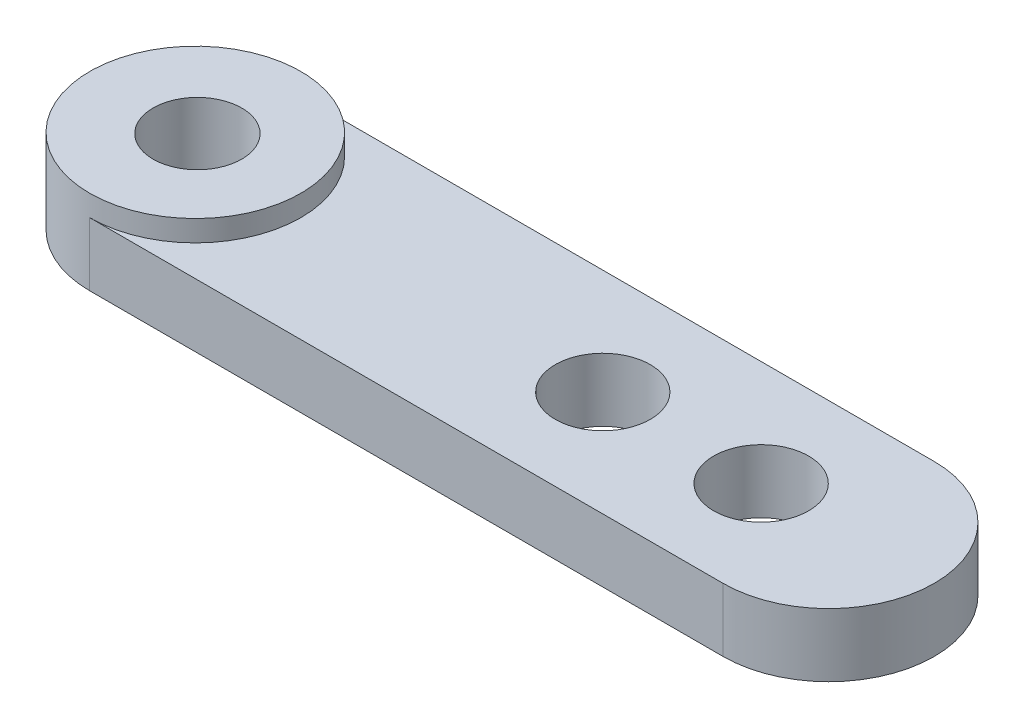
ISO-10303-21;
HEADER;
FILE_DESCRIPTION(('STEP AP214'),'2;1');
FILE_NAME('part.step','',(''),(''),'','','');
FILE_SCHEMA(('AUTOMOTIVE_DESIGN { 1 0 10303 214 1 1 1 1 }'));
ENDSEC;
DATA;
#1=APPLICATION_CONTEXT('core data for automotive mechanical design processes');
#2=APPLICATION_PROTOCOL_DEFINITION('international standard','automotive_design',2000,#1);
#3=PRODUCT_CONTEXT('',#1,'mechanical');
#4=PRODUCT('Part','Part','',(#3));
#5=PRODUCT_RELATED_PRODUCT_CATEGORY('part','',(#4));
#6=PRODUCT_DEFINITION_FORMATION('','',#4);
#7=PRODUCT_DEFINITION_CONTEXT('part definition',#1,'design');
#8=PRODUCT_DEFINITION('design','',#6,#7);
#9=PRODUCT_DEFINITION_SHAPE('','',#8);
#10=(LENGTH_UNIT() NAMED_UNIT(*) SI_UNIT(.MILLI.,.METRE.));
#11=(NAMED_UNIT(*) PLANE_ANGLE_UNIT() SI_UNIT($,.RADIAN.));
#12=(NAMED_UNIT(*) SI_UNIT($,.STERADIAN.) SOLID_ANGLE_UNIT());
#13=UNCERTAINTY_MEASURE_WITH_UNIT(LENGTH_MEASURE(1.E-05),#10,'distance_accuracy_value','');
#14=(GEOMETRIC_REPRESENTATION_CONTEXT(3) GLOBAL_UNCERTAINTY_ASSIGNED_CONTEXT((#13)) GLOBAL_UNIT_ASSIGNED_CONTEXT((#10,
#11,#12)) REPRESENTATION_CONTEXT('',''));
#15=CARTESIAN_POINT('',(0.,0.,0.));
#16=DIRECTION('',(0.,0.,1.));
#17=DIRECTION('',(1.,0.,0.));
#18=AXIS2_PLACEMENT_3D('',#15,#16,#17);
#19=CARTESIAN_POINT('',(0.,3.,0.));
#20=DIRECTION('',(0.,1.,0.));
#21=DIRECTION('',(0.,0.,1.));
#22=AXIS2_PLACEMENT_3D('',#19,#20,#21);
#23=PLANE('',#22);
#24=CARTESIAN_POINT('',(0.,3.,0.));
#25=DIRECTION('',(0.,1.,0.));
#26=DIRECTION('',(0.,0.,1.));
#27=AXIS2_PLACEMENT_3D('',#24,#25,#26);
#28=CIRCLE('',#27,5.);
#29=CARTESIAN_POINT('',(0.,3.,5.));
#30=VERTEX_POINT('',#29);
#31=CARTESIAN_POINT('',(0.,3.,-5.));
#32=VERTEX_POINT('',#31);
#33=EDGE_CURVE('E92',#30,#32,#28,.T.);
#34=ORIENTED_EDGE('',*,*,#33,.F.);
#35=DIRECTION('',(1.,0.,0.));
#36=VECTOR('',#35,1.);
#37=CARTESIAN_POINT('',(0.,3.,5.));
#38=LINE('',#37,#36);
#39=CARTESIAN_POINT('',(30.,3.,5.));
#40=VERTEX_POINT('',#39);
#41=EDGE_CURVE('E84',#30,#40,#38,.T.);
#42=ORIENTED_EDGE('',*,*,#41,.T.);
#43=CARTESIAN_POINT('',(30.,3.,0.));
#44=DIRECTION('',(0.,1.,0.));
#45=DIRECTION('',(0.,0.,1.));
#46=AXIS2_PLACEMENT_3D('',#43,#44,#45);
#47=CIRCLE('',#46,5.);
#48=CARTESIAN_POINT('',(30.,3.,-5.));
#49=VERTEX_POINT('',#48);
#50=EDGE_CURVE('E99',#40,#49,#47,.T.);
#51=ORIENTED_EDGE('',*,*,#50,.T.);
#52=DIRECTION('',(-1.,0.,0.));
#53=VECTOR('',#52,1.);
#54=CARTESIAN_POINT('',(0.,3.,-5.));
#55=LINE('',#54,#53);
#56=EDGE_CURVE('E57',#49,#32,#55,.T.);
#57=ORIENTED_EDGE('',*,*,#56,.T.);
#58=EDGE_LOOP('',(#34,#42,#51,#57));
#59=FACE_BOUND('',#58,.T.);
#60=CARTESIAN_POINT('',(19.3,3.,0.));
#61=DIRECTION('',(0.,1.,0.));
#62=DIRECTION('',(0.,0.,1.));
#63=AXIS2_PLACEMENT_3D('',#60,#61,#62);
#64=CIRCLE('',#63,2.25);
#65=CARTESIAN_POINT('',(19.3,3.,2.25));
#66=VERTEX_POINT('',#65);
#67=EDGE_CURVE('E122',#66,#66,#64,.T.);
#68=ORIENTED_EDGE('',*,*,#67,.F.);
#69=EDGE_LOOP('',(#68));
#70=FACE_BOUND('',#69,.T.);
#71=CARTESIAN_POINT('',(26.8,3.,0.));
#72=DIRECTION('',(0.,1.,0.));
#73=DIRECTION('',(0.,0.,1.));
#74=AXIS2_PLACEMENT_3D('',#71,#72,#73);
#75=CIRCLE('',#74,2.25000000000001);
#76=CARTESIAN_POINT('',(26.8,3.,2.25000000000001));
#77=VERTEX_POINT('',#76);
#78=EDGE_CURVE('E114',#77,#77,#75,.T.);
#79=ORIENTED_EDGE('',*,*,#78,.F.);
#80=EDGE_LOOP('',(#79));
#81=FACE_BOUND('',#80,.T.);
#82=ADVANCED_FACE('F39',(#59,#70,#81),#23,.T.);
#83=CARTESIAN_POINT('',(0.,0.,0.));
#84=DIRECTION('',(0.,1.,0.));
#85=DIRECTION('',(0.,0.,1.));
#86=AXIS2_PLACEMENT_3D('',#83,#84,#85);
#87=PLANE('',#86);
#88=CARTESIAN_POINT('',(0.,0.,0.));
#89=DIRECTION('',(0.,1.,0.));
#90=DIRECTION('',(0.,0.,1.));
#91=AXIS2_PLACEMENT_3D('',#88,#89,#90);
#92=CIRCLE('',#91,5.);
#93=CARTESIAN_POINT('',(0.,0.,-5.));
#94=VERTEX_POINT('',#93);
#95=CARTESIAN_POINT('',(0.,0.,5.));
#96=VERTEX_POINT('',#95);
#97=EDGE_CURVE('E94',#94,#96,#92,.T.);
#98=ORIENTED_EDGE('',*,*,#97,.F.);
#99=DIRECTION('',(-1.,0.,0.));
#100=VECTOR('',#99,1.);
#101=CARTESIAN_POINT('',(0.,0.,-5.));
#102=LINE('',#101,#100);
#103=CARTESIAN_POINT('',(30.,0.,-5.));
#104=VERTEX_POINT('',#103);
#105=EDGE_CURVE('E80',#104,#94,#102,.T.);
#106=ORIENTED_EDGE('',*,*,#105,.F.);
#107=CARTESIAN_POINT('',(30.,0.,0.));
#108=DIRECTION('',(0.,1.,0.));
#109=DIRECTION('',(0.,0.,1.));
#110=AXIS2_PLACEMENT_3D('',#107,#108,#109);
#111=CIRCLE('',#110,5.);
#112=CARTESIAN_POINT('',(30.,0.,5.));
#113=VERTEX_POINT('',#112);
#114=EDGE_CURVE('E75',#113,#104,#111,.T.);
#115=ORIENTED_EDGE('',*,*,#114,.F.);
#116=DIRECTION('',(1.,0.,0.));
#117=VECTOR('',#116,1.);
#118=CARTESIAN_POINT('',(0.,0.,5.));
#119=LINE('',#118,#117);
#120=EDGE_CURVE('E140',#96,#113,#119,.T.);
#121=ORIENTED_EDGE('',*,*,#120,.F.);
#122=EDGE_LOOP('',(#98,#106,#115,#121));
#123=FACE_BOUND('',#122,.T.);
#124=CARTESIAN_POINT('',(0.1,0.,0.));
#125=DIRECTION('',(0.,1.,0.));
#126=DIRECTION('',(0.,0.,1.));
#127=AXIS2_PLACEMENT_3D('',#124,#125,#126);
#128=CIRCLE('',#127,2.10000000000001);
#129=CARTESIAN_POINT('',(0.1,0.,2.10000000000001));
#130=VERTEX_POINT('',#129);
#131=EDGE_CURVE('E126',#130,#130,#128,.T.);
#132=ORIENTED_EDGE('',*,*,#131,.T.);
#133=EDGE_LOOP('',(#132));
#134=FACE_BOUND('',#133,.T.);
#135=CARTESIAN_POINT('',(19.3,0.,0.));
#136=DIRECTION('',(0.,1.,0.));
#137=DIRECTION('',(0.,0.,1.));
#138=AXIS2_PLACEMENT_3D('',#135,#136,#137);
#139=CIRCLE('',#138,2.25);
#140=CARTESIAN_POINT('',(19.3,0.,2.25));
#141=VERTEX_POINT('',#140);
#142=EDGE_CURVE('E118',#141,#141,#139,.T.);
#143=ORIENTED_EDGE('',*,*,#142,.T.);
#144=EDGE_LOOP('',(#143));
#145=FACE_BOUND('',#144,.T.);
#146=CARTESIAN_POINT('',(26.8,0.,0.));
#147=DIRECTION('',(0.,1.,0.));
#148=DIRECTION('',(0.,0.,1.));
#149=AXIS2_PLACEMENT_3D('',#146,#147,#148);
#150=CIRCLE('',#149,2.25000000000001);
#151=CARTESIAN_POINT('',(26.8,0.,2.25000000000001));
#152=VERTEX_POINT('',#151);
#153=EDGE_CURVE('E109',#152,#152,#150,.T.);
#154=ORIENTED_EDGE('',*,*,#153,.T.);
#155=EDGE_LOOP('',(#154));
#156=FACE_BOUND('',#155,.T.);
#157=ADVANCED_FACE('F154',(#123,#134,#145,#156),#87,.F.);
#158=CARTESIAN_POINT('',(0.,3.,0.));
#159=DIRECTION('',(0.,-1.,0.));
#160=DIRECTION('',(0.,0.,-1.));
#161=AXIS2_PLACEMENT_3D('',#158,#159,#160);
#162=CYLINDRICAL_SURFACE('',#161,5.);
#163=ORIENTED_EDGE('',*,*,#97,.T.);
#164=DIRECTION('',(0.,-1.,0.));
#165=VECTOR('',#164,1.);
#166=CARTESIAN_POINT('',(0.,3.,5.));
#167=LINE('',#166,#165);
#168=EDGE_CURVE('E11',#30,#96,#167,.T.);
#169=ORIENTED_EDGE('',*,*,#168,.F.);
#170=ORIENTED_EDGE('',*,*,#33,.T.);
#171=DIRECTION('',(0.,-1.,0.));
#172=VECTOR('',#171,1.);
#173=CARTESIAN_POINT('',(0.,3.,-5.));
#174=LINE('',#173,#172);
#175=EDGE_CURVE('E137',#32,#94,#174,.T.);
#176=ORIENTED_EDGE('',*,*,#175,.T.);
#177=EDGE_LOOP('',(#163,#169,#170,#176));
#178=FACE_BOUND('',#177,.T.);
#179=CARTESIAN_POINT('',(0.,4.,0.));
#180=DIRECTION('',(0.,1.,0.));
#181=DIRECTION('',(0.,0.,1.));
#182=AXIS2_PLACEMENT_3D('',#179,#180,#181);
#183=CIRCLE('',#182,5.);
#184=CARTESIAN_POINT('',(0.,4.,5.));
#185=VERTEX_POINT('',#184);
#186=EDGE_CURVE('E103',#185,#185,#183,.T.);
#187=ORIENTED_EDGE('',*,*,#186,.F.);
#188=EDGE_LOOP('',(#187));
#189=FACE_BOUND('',#188,.T.);
#190=ADVANCED_FACE('F41',(#178,#189),#162,.T.);
#191=CARTESIAN_POINT('',(0.,3.,5.));
#192=DIRECTION('',(0.,0.,-1.));
#193=DIRECTION('',(-1.,0.,0.));
#194=AXIS2_PLACEMENT_3D('',#191,#192,#193);
#195=PLANE('',#194);
#196=ORIENTED_EDGE('',*,*,#120,.T.);
#197=DIRECTION('',(0.,-1.,0.));
#198=VECTOR('',#197,1.);
#199=CARTESIAN_POINT('',(30.,3.,5.));
#200=LINE('',#199,#198);
#201=EDGE_CURVE('E49',#40,#113,#200,.T.);
#202=ORIENTED_EDGE('',*,*,#201,.F.);
#203=ORIENTED_EDGE('',*,*,#41,.F.);
#204=ORIENTED_EDGE('',*,*,#168,.T.);
#205=EDGE_LOOP('',(#196,#202,#203,#204));
#206=FACE_BOUND('',#205,.T.);
#207=ADVANCED_FACE('F96',(#206),#195,.F.);
#208=CARTESIAN_POINT('',(30.,3.,0.));
#209=DIRECTION('',(0.,-1.,0.));
#210=DIRECTION('',(0.,0.,-1.));
#211=AXIS2_PLACEMENT_3D('',#208,#209,#210);
#212=CYLINDRICAL_SURFACE('',#211,5.);
#213=ORIENTED_EDGE('',*,*,#114,.T.);
#214=DIRECTION('',(0.,-1.,0.));
#215=VECTOR('',#214,1.);
#216=CARTESIAN_POINT('',(30.,3.,-5.));
#217=LINE('',#216,#215);
#218=EDGE_CURVE('E149',#49,#104,#217,.T.);
#219=ORIENTED_EDGE('',*,*,#218,.F.);
#220=ORIENTED_EDGE('',*,*,#50,.F.);
#221=ORIENTED_EDGE('',*,*,#201,.T.);
#222=EDGE_LOOP('',(#213,#219,#220,#221));
#223=FACE_BOUND('',#222,.T.);
#224=ADVANCED_FACE('F152',(#223),#212,.T.);
#225=CARTESIAN_POINT('',(0.,3.,-5.));
#226=DIRECTION('',(0.,0.,1.));
#227=DIRECTION('',(1.,0.,0.));
#228=AXIS2_PLACEMENT_3D('',#225,#226,#227);
#229=PLANE('',#228);
#230=ORIENTED_EDGE('',*,*,#105,.T.);
#231=ORIENTED_EDGE('',*,*,#175,.F.);
#232=ORIENTED_EDGE('',*,*,#56,.F.);
#233=ORIENTED_EDGE('',*,*,#218,.T.);
#234=EDGE_LOOP('',(#230,#231,#232,#233));
#235=FACE_BOUND('',#234,.T.);
#236=ADVANCED_FACE('F185',(#235),#229,.F.);
#237=CARTESIAN_POINT('',(0.1,3.,0.));
#238=DIRECTION('',(0.,-1.,0.));
#239=DIRECTION('',(0.,0.,-1.));
#240=AXIS2_PLACEMENT_3D('',#237,#238,#239);
#241=CYLINDRICAL_SURFACE('',#240,2.10000000000001);
#242=ORIENTED_EDGE('',*,*,#131,.F.);
#243=EDGE_LOOP('',(#242));
#244=FACE_BOUND('',#243,.T.);
#245=CARTESIAN_POINT('',(0.1,4.,0.));
#246=DIRECTION('',(0.,1.,0.));
#247=DIRECTION('',(0.,0.,1.));
#248=AXIS2_PLACEMENT_3D('',#245,#246,#247);
#249=CIRCLE('',#248,2.10000000000001);
#250=CARTESIAN_POINT('',(0.1,4.,2.10000000000001));
#251=VERTEX_POINT('',#250);
#252=EDGE_CURVE('E104',#251,#251,#249,.T.);
#253=ORIENTED_EDGE('',*,*,#252,.T.);
#254=EDGE_LOOP('',(#253));
#255=FACE_BOUND('',#254,.T.);
#256=ADVANCED_FACE('F176',(#244,#255),#241,.F.);
#257=CARTESIAN_POINT('',(19.3,3.,0.));
#258=DIRECTION('',(0.,-1.,0.));
#259=DIRECTION('',(0.,0.,-1.));
#260=AXIS2_PLACEMENT_3D('',#257,#258,#259);
#261=CYLINDRICAL_SURFACE('',#260,2.25);
#262=ORIENTED_EDGE('',*,*,#67,.T.);
#263=EDGE_LOOP('',(#262));
#264=FACE_BOUND('',#263,.T.);
#265=ORIENTED_EDGE('',*,*,#142,.F.);
#266=EDGE_LOOP('',(#265));
#267=FACE_BOUND('',#266,.T.);
#268=ADVANCED_FACE('F167',(#264,#267),#261,.F.);
#269=CARTESIAN_POINT('',(26.8,3.,0.));
#270=DIRECTION('',(0.,-1.,0.));
#271=DIRECTION('',(0.,0.,-1.));
#272=AXIS2_PLACEMENT_3D('',#269,#270,#271);
#273=CYLINDRICAL_SURFACE('',#272,2.25000000000001);
#274=ORIENTED_EDGE('',*,*,#78,.T.);
#275=EDGE_LOOP('',(#274));
#276=FACE_BOUND('',#275,.T.);
#277=ORIENTED_EDGE('',*,*,#153,.F.);
#278=EDGE_LOOP('',(#277));
#279=FACE_BOUND('',#278,.T.);
#280=ADVANCED_FACE('F164',(#276,#279),#273,.F.);
#281=CARTESIAN_POINT('',(0.,4.,0.));
#282=DIRECTION('',(0.,1.,0.));
#283=DIRECTION('',(0.,0.,1.));
#284=AXIS2_PLACEMENT_3D('',#281,#282,#283);
#285=PLANE('',#284);
#286=ORIENTED_EDGE('',*,*,#186,.T.);
#287=EDGE_LOOP('',(#286));
#288=FACE_BOUND('',#287,.T.);
#289=ORIENTED_EDGE('',*,*,#252,.F.);
#290=EDGE_LOOP('',(#289));
#291=FACE_BOUND('',#290,.T.);
#292=ADVANCED_FACE('F166',(#288,#291),#285,.T.);
#293=CLOSED_SHELL('',(#82,#157,#190,#207,#224,#236,#256,#268,#280,#292));
#294=MANIFOLD_SOLID_BREP('B2',#293);
#295=ADVANCED_BREP_SHAPE_REPRESENTATION('',(#18,#294),#14);
#296=SHAPE_DEFINITION_REPRESENTATION(#9,#295);
ENDSEC;
END-ISO-10303-21;
